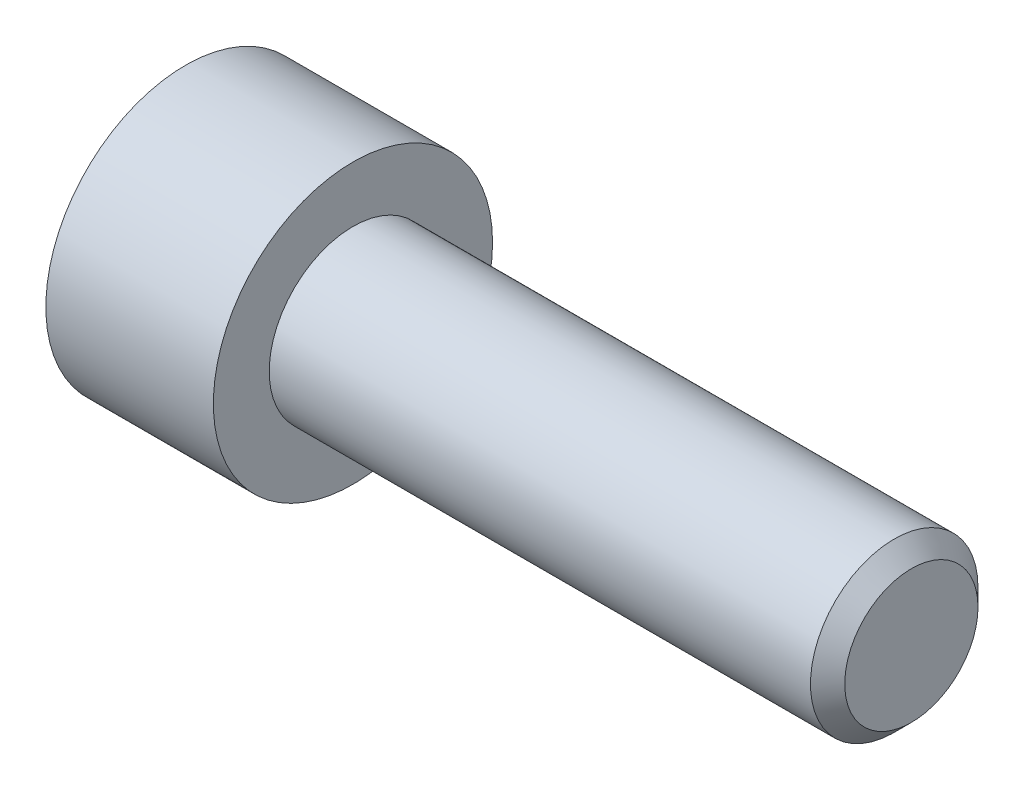
ISO-10303-21;
HEADER;
FILE_DESCRIPTION(('STEP AP214'),'2;1');
FILE_NAME('part.step','',(''),(''),'','','');
FILE_SCHEMA(('AUTOMOTIVE_DESIGN { 1 0 10303 214 1 1 1 1 }'));
ENDSEC;
DATA;
#1=APPLICATION_CONTEXT('core data for automotive mechanical design processes');
#2=APPLICATION_PROTOCOL_DEFINITION('international standard','automotive_design',2000,#1);
#3=PRODUCT_CONTEXT('',#1,'mechanical');
#4=PRODUCT('Part','Part','',(#3));
#5=PRODUCT_RELATED_PRODUCT_CATEGORY('part','',(#4));
#6=PRODUCT_DEFINITION_FORMATION('','',#4);
#7=PRODUCT_DEFINITION_CONTEXT('part definition',#1,'design');
#8=PRODUCT_DEFINITION('design','',#6,#7);
#9=PRODUCT_DEFINITION_SHAPE('','',#8);
#10=(LENGTH_UNIT() NAMED_UNIT(*) SI_UNIT(.MILLI.,.METRE.));
#11=(NAMED_UNIT(*) PLANE_ANGLE_UNIT() SI_UNIT($,.RADIAN.));
#12=(NAMED_UNIT(*) SI_UNIT($,.STERADIAN.) SOLID_ANGLE_UNIT());
#13=UNCERTAINTY_MEASURE_WITH_UNIT(LENGTH_MEASURE(1.E-05),#10,'distance_accuracy_value','');
#14=(GEOMETRIC_REPRESENTATION_CONTEXT(3) GLOBAL_UNCERTAINTY_ASSIGNED_CONTEXT((#13)) GLOBAL_UNIT_ASSIGNED_CONTEXT((#10,
#11,#12)) REPRESENTATION_CONTEXT('',''));
#15=CARTESIAN_POINT('',(0.,0.,0.));
#16=DIRECTION('',(0.,0.,1.));
#17=DIRECTION('',(1.,0.,0.));
#18=AXIS2_PLACEMENT_3D('',#15,#16,#17);
#19=CARTESIAN_POINT('',(20.,0.,0.));
#20=DIRECTION('',(-1.,0.,0.));
#21=DIRECTION('',(0.,0.,-1.));
#22=AXIS2_PLACEMENT_3D('',#19,#20,#21);
#23=CYLINDRICAL_SURFACE('',#22,5.);
#24=CARTESIAN_POINT('',(-6.,0.,0.));
#25=DIRECTION('',(1.,0.,0.));
#26=DIRECTION('',(0.,0.,-1.));
#27=AXIS2_PLACEMENT_3D('',#24,#25,#26);
#28=CIRCLE('',#27,5.);
#29=CARTESIAN_POINT('',(-6.,0.,-5.));
#30=VERTEX_POINT('',#29);
#31=EDGE_CURVE('E10',#30,#30,#28,.T.);
#32=ORIENTED_EDGE('',*,*,#31,.T.);
#33=EDGE_LOOP('',(#32));
#34=FACE_BOUND('',#33,.T.);
#35=CARTESIAN_POINT('',(0.,0.,0.));
#36=DIRECTION('',(1.,0.,0.));
#37=DIRECTION('',(0.,0.,-1.));
#38=AXIS2_PLACEMENT_3D('',#35,#36,#37);
#39=CIRCLE('',#38,5.);
#40=CARTESIAN_POINT('',(0.,0.,-5.));
#41=VERTEX_POINT('',#40);
#42=EDGE_CURVE('E195',#41,#41,#39,.T.);
#43=ORIENTED_EDGE('',*,*,#42,.F.);
#44=EDGE_LOOP('',(#43));
#45=FACE_BOUND('',#44,.T.);
#46=ADVANCED_FACE('F15',(#34,#45),#23,.T.);
#47=CARTESIAN_POINT('',(-6.,0.,0.));
#48=DIRECTION('',(1.,0.,0.));
#49=DIRECTION('',(0.,1.,0.));
#50=AXIS2_PLACEMENT_3D('',#47,#48,#49);
#51=PLANE('',#50);
#52=ORIENTED_EDGE('',*,*,#31,.F.);
#53=EDGE_LOOP('',(#52));
#54=FACE_BOUND('',#53,.T.);
#55=DIRECTION('',(0.,-1.,0.));
#56=VECTOR('',#55,1.);
#57=CARTESIAN_POINT('',(-6.,1.44337567297406,2.5));
#58=LINE('',#57,#56);
#59=CARTESIAN_POINT('',(-6.,1.44337567297406,2.5));
#60=VERTEX_POINT('',#59);
#61=CARTESIAN_POINT('',(-6.,-1.44337567297406,2.5));
#62=VERTEX_POINT('',#61);
#63=EDGE_CURVE('E26',#60,#62,#58,.T.);
#64=ORIENTED_EDGE('',*,*,#63,.T.);
#65=DIRECTION('',(0.,-0.5,-0.866025403784439));
#66=VECTOR('',#65,1.);
#67=CARTESIAN_POINT('',(-6.,-1.44337567297406,2.5));
#68=LINE('',#67,#66);
#69=CARTESIAN_POINT('',(-6.,-2.88675134594813,0.));
#70=VERTEX_POINT('',#69);
#71=EDGE_CURVE('E159',#62,#70,#68,.T.);
#72=ORIENTED_EDGE('',*,*,#71,.T.);
#73=DIRECTION('',(0.,0.5,-0.866025403784439));
#74=VECTOR('',#73,1.);
#75=CARTESIAN_POINT('',(-6.,-2.88675134594813,0.));
#76=LINE('',#75,#74);
#77=CARTESIAN_POINT('',(-6.,-1.44337567297406,-2.5));
#78=VERTEX_POINT('',#77);
#79=EDGE_CURVE('E169',#70,#78,#76,.T.);
#80=ORIENTED_EDGE('',*,*,#79,.T.);
#81=DIRECTION('',(0.,1.,0.));
#82=VECTOR('',#81,1.);
#83=CARTESIAN_POINT('',(-6.,-1.44337567297406,-2.5));
#84=LINE('',#83,#82);
#85=CARTESIAN_POINT('',(-6.,1.44337567297406,-2.5));
#86=VERTEX_POINT('',#85);
#87=EDGE_CURVE('E133',#78,#86,#84,.T.);
#88=ORIENTED_EDGE('',*,*,#87,.T.);
#89=DIRECTION('',(0.,0.5,0.866025403784439));
#90=VECTOR('',#89,1.);
#91=CARTESIAN_POINT('',(-6.,1.44337567297406,-2.5));
#92=LINE('',#91,#90);
#93=CARTESIAN_POINT('',(-6.,2.88675134594813,0.));
#94=VERTEX_POINT('',#93);
#95=EDGE_CURVE('E127',#86,#94,#92,.T.);
#96=ORIENTED_EDGE('',*,*,#95,.T.);
#97=DIRECTION('',(0.,-0.5,0.866025403784439));
#98=VECTOR('',#97,1.);
#99=CARTESIAN_POINT('',(-6.,2.88675134594813,0.));
#100=LINE('',#99,#98);
#101=EDGE_CURVE('E116',#94,#60,#100,.T.);
#102=ORIENTED_EDGE('',*,*,#101,.T.);
#103=EDGE_LOOP('',(#64,#72,#80,#88,#96,#102));
#104=FACE_BOUND('',#103,.T.);
#105=ADVANCED_FACE('F94',(#54,#104),#51,.F.);
#106=CARTESIAN_POINT('',(-3.,-1.44337567297406,2.5));
#107=DIRECTION('',(0.,0.866025403784439,-0.5));
#108=DIRECTION('',(-1.,0.,0.));
#109=AXIS2_PLACEMENT_3D('',#106,#107,#108);
#110=PLANE('',#109);
#111=ORIENTED_EDGE('',*,*,#71,.F.);
#112=DIRECTION('',(-1.,0.,0.));
#113=VECTOR('',#112,1.);
#114=CARTESIAN_POINT('',(-3.,-1.44337567297406,2.5));
#115=LINE('',#114,#113);
#116=CARTESIAN_POINT('',(-3.,-1.44337567297406,2.5));
#117=VERTEX_POINT('',#116);
#118=EDGE_CURVE('E164',#117,#62,#115,.T.);
#119=ORIENTED_EDGE('',*,*,#118,.F.);
#120=DIRECTION('',(0.,-0.5,-0.866025403784439));
#121=VECTOR('',#120,1.);
#122=CARTESIAN_POINT('',(-3.,-1.44337567297406,2.5));
#123=LINE('',#122,#121);
#124=CARTESIAN_POINT('',(-3.,-2.88675134594813,0.));
#125=VERTEX_POINT('',#124);
#126=EDGE_CURVE('E128',#117,#125,#123,.T.);
#127=ORIENTED_EDGE('',*,*,#126,.T.);
#128=DIRECTION('',(-1.,0.,0.));
#129=VECTOR('',#128,1.);
#130=CARTESIAN_POINT('',(-3.,-2.88675134594813,0.));
#131=LINE('',#130,#129);
#132=EDGE_CURVE('E181',#125,#70,#131,.T.);
#133=ORIENTED_EDGE('',*,*,#132,.T.);
#134=EDGE_LOOP('',(#111,#119,#127,#133));
#135=FACE_BOUND('',#134,.T.);
#136=ADVANCED_FACE('F100',(#135),#110,.T.);
#137=CARTESIAN_POINT('',(-3.,-2.88675134594813,0.));
#138=DIRECTION('',(0.,0.866025403784439,0.5));
#139=DIRECTION('',(1.,0.,0.));
#140=AXIS2_PLACEMENT_3D('',#137,#138,#139);
#141=PLANE('',#140);
#142=ORIENTED_EDGE('',*,*,#79,.F.);
#143=ORIENTED_EDGE('',*,*,#132,.F.);
#144=DIRECTION('',(0.,0.5,-0.866025403784439));
#145=VECTOR('',#144,1.);
#146=CARTESIAN_POINT('',(-3.,-2.88675134594813,0.));
#147=LINE('',#146,#145);
#148=CARTESIAN_POINT('',(-3.,-1.44337567297406,-2.5));
#149=VERTEX_POINT('',#148);
#150=EDGE_CURVE('E173',#125,#149,#147,.T.);
#151=ORIENTED_EDGE('',*,*,#150,.T.);
#152=DIRECTION('',(-1.,0.,0.));
#153=VECTOR('',#152,1.);
#154=CARTESIAN_POINT('',(-3.,-1.44337567297406,-2.5));
#155=LINE('',#154,#153);
#156=EDGE_CURVE('E170',#149,#78,#155,.T.);
#157=ORIENTED_EDGE('',*,*,#156,.T.);
#158=EDGE_LOOP('',(#142,#143,#151,#157));
#159=FACE_BOUND('',#158,.T.);
#160=ADVANCED_FACE('F246',(#159),#141,.T.);
#161=CARTESIAN_POINT('',(-3.,1.44337567297406,2.5));
#162=DIRECTION('',(0.,0.,-1.));
#163=DIRECTION('',(0.,-1.,0.));
#164=AXIS2_PLACEMENT_3D('',#161,#162,#163);
#165=PLANE('',#164);
#166=ORIENTED_EDGE('',*,*,#63,.F.);
#167=DIRECTION('',(-1.,0.,0.));
#168=VECTOR('',#167,1.);
#169=CARTESIAN_POINT('',(-3.,1.44337567297406,2.5));
#170=LINE('',#169,#168);
#171=CARTESIAN_POINT('',(-3.,1.44337567297406,2.5));
#172=VERTEX_POINT('',#171);
#173=EDGE_CURVE('E122',#172,#60,#170,.T.);
#174=ORIENTED_EDGE('',*,*,#173,.F.);
#175=DIRECTION('',(0.,-1.,0.));
#176=VECTOR('',#175,1.);
#177=CARTESIAN_POINT('',(-3.,1.44337567297406,2.5));
#178=LINE('',#177,#176);
#179=EDGE_CURVE('E174',#172,#117,#178,.T.);
#180=ORIENTED_EDGE('',*,*,#179,.T.);
#181=ORIENTED_EDGE('',*,*,#118,.T.);
#182=EDGE_LOOP('',(#166,#174,#180,#181));
#183=FACE_BOUND('',#182,.T.);
#184=ADVANCED_FACE('F17',(#183),#165,.T.);
#185=CARTESIAN_POINT('',(20.,2.3865,0.));
#186=DIRECTION('',(-1.,0.,0.));
#187=DIRECTION('',(0.,0.,1.));
#188=AXIS2_PLACEMENT_3D('',#185,#186,#187);
#189=PLANE('',#188);
#190=CARTESIAN_POINT('',(20.,0.,0.));
#191=DIRECTION('',(1.,0.,0.));
#192=DIRECTION('',(0.,0.,-1.));
#193=AXIS2_PLACEMENT_3D('',#190,#191,#192);
#194=CIRCLE('',#193,2.3865);
#195=CARTESIAN_POINT('',(20.,0.,-2.3865));
#196=VERTEX_POINT('',#195);
#197=EDGE_CURVE('E161',#196,#196,#194,.T.);
#198=ORIENTED_EDGE('',*,*,#197,.T.);
#199=EDGE_LOOP('',(#198));
#200=FACE_BOUND('',#199,.T.);
#201=ADVANCED_FACE('F261',(#200),#189,.F.);
#202=CARTESIAN_POINT('',(19.3865,0.,0.));
#203=DIRECTION('',(-1.,0.,0.));
#204=DIRECTION('',(0.,0.,1.));
#205=AXIS2_PLACEMENT_3D('',#202,#203,#204);
#206=CONICAL_SURFACE('',#205,3.,0.785398163397446);
#207=CARTESIAN_POINT('',(19.3865,0.,0.));
#208=DIRECTION('',(1.,0.,0.));
#209=DIRECTION('',(0.,0.,-1.));
#210=AXIS2_PLACEMENT_3D('',#207,#208,#209);
#211=CIRCLE('',#210,3.);
#212=CARTESIAN_POINT('',(19.3865,0.,-3.));
#213=VERTEX_POINT('',#212);
#214=EDGE_CURVE('E165',#213,#213,#211,.T.);
#215=ORIENTED_EDGE('',*,*,#214,.T.);
#216=EDGE_LOOP('',(#215));
#217=FACE_BOUND('',#216,.T.);
#218=ORIENTED_EDGE('',*,*,#197,.F.);
#219=EDGE_LOOP('',(#218));
#220=FACE_BOUND('',#219,.T.);
#221=ADVANCED_FACE('F292',(#217,#220),#206,.T.);
#222=CARTESIAN_POINT('',(20.,0.,0.));
#223=DIRECTION('',(-1.,0.,0.));
#224=DIRECTION('',(0.,0.,-1.));
#225=AXIS2_PLACEMENT_3D('',#222,#223,#224);
#226=CYLINDRICAL_SURFACE('',#225,3.);
#227=CARTESIAN_POINT('',(0.,0.,0.));
#228=DIRECTION('',(1.,0.,0.));
#229=DIRECTION('',(0.,0.,-1.));
#230=AXIS2_PLACEMENT_3D('',#227,#228,#229);
#231=CIRCLE('',#230,3.);
#232=CARTESIAN_POINT('',(0.,0.,-3.));
#233=VERTEX_POINT('',#232);
#234=EDGE_CURVE('E158',#233,#233,#231,.T.);
#235=ORIENTED_EDGE('',*,*,#234,.T.);
#236=EDGE_LOOP('',(#235));
#237=FACE_BOUND('',#236,.T.);
#238=ORIENTED_EDGE('',*,*,#214,.F.);
#239=EDGE_LOOP('',(#238));
#240=FACE_BOUND('',#239,.T.);
#241=ADVANCED_FACE('F104',(#237,#240),#226,.T.);
#242=CARTESIAN_POINT('',(0.,5.,0.));
#243=DIRECTION('',(-1.,0.,0.));
#244=DIRECTION('',(0.,0.,1.));
#245=AXIS2_PLACEMENT_3D('',#242,#243,#244);
#246=PLANE('',#245);
#247=ORIENTED_EDGE('',*,*,#42,.T.);
#248=EDGE_LOOP('',(#247));
#249=FACE_BOUND('',#248,.T.);
#250=ORIENTED_EDGE('',*,*,#234,.F.);
#251=EDGE_LOOP('',(#250));
#252=FACE_BOUND('',#251,.T.);
#253=ADVANCED_FACE('F291',(#249,#252),#246,.F.);
#254=CARTESIAN_POINT('',(-3.,-1.44337567297406,-2.5));
#255=DIRECTION('',(0.,0.,1.));
#256=DIRECTION('',(1.,0.,0.));
#257=AXIS2_PLACEMENT_3D('',#254,#255,#256);
#258=PLANE('',#257);
#259=ORIENTED_EDGE('',*,*,#87,.F.);
#260=ORIENTED_EDGE('',*,*,#156,.F.);
#261=DIRECTION('',(0.,1.,0.));
#262=VECTOR('',#261,1.);
#263=CARTESIAN_POINT('',(-3.,-1.44337567297406,-2.5));
#264=LINE('',#263,#262);
#265=CARTESIAN_POINT('',(-3.,1.44337567297406,-2.5));
#266=VERTEX_POINT('',#265);
#267=EDGE_CURVE('E187',#149,#266,#264,.T.);
#268=ORIENTED_EDGE('',*,*,#267,.T.);
#269=DIRECTION('',(-1.,0.,0.));
#270=VECTOR('',#269,1.);
#271=CARTESIAN_POINT('',(-3.,1.44337567297406,-2.5));
#272=LINE('',#271,#270);
#273=EDGE_CURVE('E147',#266,#86,#272,.T.);
#274=ORIENTED_EDGE('',*,*,#273,.T.);
#275=EDGE_LOOP('',(#259,#260,#268,#274));
#276=FACE_BOUND('',#275,.T.);
#277=ADVANCED_FACE('F107',(#276),#258,.T.);
#278=CARTESIAN_POINT('',(-3.,1.44337567297406,-2.5));
#279=DIRECTION('',(0.,-0.866025403784439,0.5));
#280=DIRECTION('',(-1.,0.,0.));
#281=AXIS2_PLACEMENT_3D('',#278,#279,#280);
#282=PLANE('',#281);
#283=ORIENTED_EDGE('',*,*,#95,.F.);
#284=ORIENTED_EDGE('',*,*,#273,.F.);
#285=DIRECTION('',(0.,0.5,0.866025403784439));
#286=VECTOR('',#285,1.);
#287=CARTESIAN_POINT('',(-3.,1.44337567297406,-2.5));
#288=LINE('',#287,#286);
#289=CARTESIAN_POINT('',(-3.,2.88675134594813,0.));
#290=VERTEX_POINT('',#289);
#291=EDGE_CURVE('E139',#266,#290,#288,.T.);
#292=ORIENTED_EDGE('',*,*,#291,.T.);
#293=DIRECTION('',(-1.,0.,0.));
#294=VECTOR('',#293,1.);
#295=CARTESIAN_POINT('',(-3.,2.88675134594813,0.));
#296=LINE('',#295,#294);
#297=EDGE_CURVE('E19',#290,#94,#296,.T.);
#298=ORIENTED_EDGE('',*,*,#297,.T.);
#299=EDGE_LOOP('',(#283,#284,#292,#298));
#300=FACE_BOUND('',#299,.T.);
#301=ADVANCED_FACE('F105',(#300),#282,.T.);
#302=CARTESIAN_POINT('',(-3.,2.88675134594813,0.));
#303=DIRECTION('',(0.,-0.866025403784439,-0.5));
#304=DIRECTION('',(0.,0.5,-0.866025403784439));
#305=AXIS2_PLACEMENT_3D('',#302,#303,#304);
#306=PLANE('',#305);
#307=ORIENTED_EDGE('',*,*,#101,.F.);
#308=ORIENTED_EDGE('',*,*,#297,.F.);
#309=DIRECTION('',(0.,-0.5,0.866025403784439));
#310=VECTOR('',#309,1.);
#311=CARTESIAN_POINT('',(-3.,2.88675134594813,0.));
#312=LINE('',#311,#310);
#313=EDGE_CURVE('E142',#290,#172,#312,.T.);
#314=ORIENTED_EDGE('',*,*,#313,.T.);
#315=ORIENTED_EDGE('',*,*,#173,.T.);
#316=EDGE_LOOP('',(#307,#308,#314,#315));
#317=FACE_BOUND('',#316,.T.);
#318=ADVANCED_FACE('F89',(#317),#306,.T.);
#319=CARTESIAN_POINT('',(-3.,0.,0.));
#320=DIRECTION('',(1.,0.,0.));
#321=DIRECTION('',(0.,1.,0.));
#322=AXIS2_PLACEMENT_3D('',#319,#320,#321);
#323=PLANE('',#322);
#324=ORIENTED_EDGE('',*,*,#179,.F.);
#325=ORIENTED_EDGE('',*,*,#313,.F.);
#326=ORIENTED_EDGE('',*,*,#291,.F.);
#327=ORIENTED_EDGE('',*,*,#267,.F.);
#328=ORIENTED_EDGE('',*,*,#150,.F.);
#329=ORIENTED_EDGE('',*,*,#126,.F.);
#330=EDGE_LOOP('',(#324,#325,#326,#327,#328,#329));
#331=FACE_BOUND('',#330,.T.);
#332=CARTESIAN_POINT('',(-3.,0.,0.));
#333=DIRECTION('',(1.,0.,0.));
#334=DIRECTION('',(0.,0.,-1.));
#335=AXIS2_PLACEMENT_3D('',#332,#333,#334);
#336=CIRCLE('',#335,2.49);
#337=CARTESIAN_POINT('',(-3.,0.,-2.49));
#338=VERTEX_POINT('',#337);
#339=EDGE_CURVE('E72',#338,#338,#336,.T.);
#340=ORIENTED_EDGE('',*,*,#339,.T.);
#341=EDGE_LOOP('',(#340));
#342=FACE_BOUND('',#341,.T.);
#343=ADVANCED_FACE('F83',(#331,#342),#323,.F.);
#344=CARTESIAN_POINT('',(-3.,0.,0.));
#345=DIRECTION('',(-1.,0.,0.));
#346=DIRECTION('',(0.,0.,1.));
#347=AXIS2_PLACEMENT_3D('',#344,#345,#346);
#348=CONICAL_SURFACE('',#347,2.49,1.0471975511966);
#349=ORIENTED_EDGE('',*,*,#339,.F.);
#350=EDGE_LOOP('',(#349));
#351=FACE_BOUND('',#350,.T.);
#352=CARTESIAN_POINT('',(-1.56239782971783,0.,0.));
#353=VERTEX_POINT('',#352);
#354=VERTEX_LOOP('',#353);
#355=FACE_BOUND('',#354,.T.);
#356=ADVANCED_FACE('F81',(#351,#355),#348,.F.);
#357=CLOSED_SHELL('',(#46,#105,#136,#160,#184,#201,#221,#241,#253,#277,#301,#318,#343,#356));
#358=MANIFOLD_SOLID_BREP('B1',#357);
#359=ADVANCED_BREP_SHAPE_REPRESENTATION('',(#18,#358),#14);
#360=SHAPE_DEFINITION_REPRESENTATION(#9,#359);
ENDSEC;
END-ISO-10303-21;
